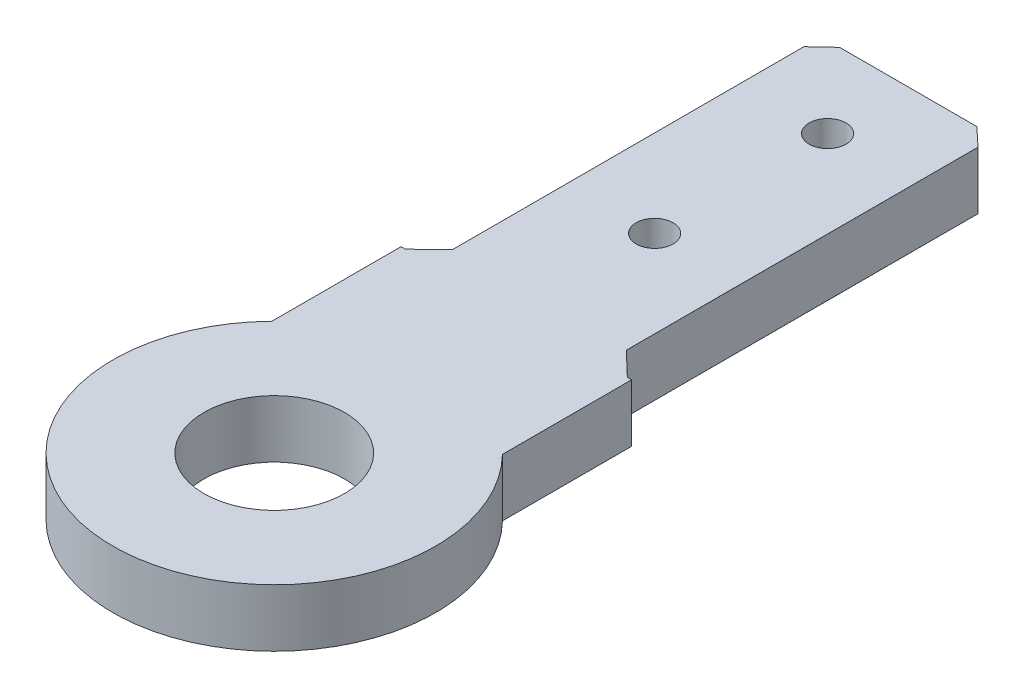
ISO-10303-21;
HEADER;
FILE_DESCRIPTION(('STEP AP214'),'2;1');
FILE_NAME('part.step','',(''),(''),'','','');
FILE_SCHEMA(('AUTOMOTIVE_DESIGN { 1 0 10303 214 1 1 1 1 }'));
ENDSEC;
DATA;
#1=APPLICATION_CONTEXT('core data for automotive mechanical design processes');
#2=APPLICATION_PROTOCOL_DEFINITION('international standard','automotive_design',2000,#1);
#3=PRODUCT_CONTEXT('',#1,'mechanical');
#4=PRODUCT('Part','Part','',(#3));
#5=PRODUCT_RELATED_PRODUCT_CATEGORY('part','',(#4));
#6=PRODUCT_DEFINITION_FORMATION('','',#4);
#7=PRODUCT_DEFINITION_CONTEXT('part definition',#1,'design');
#8=PRODUCT_DEFINITION('design','',#6,#7);
#9=PRODUCT_DEFINITION_SHAPE('','',#8);
#10=(LENGTH_UNIT() NAMED_UNIT(*) SI_UNIT(.MILLI.,.METRE.));
#11=(NAMED_UNIT(*) PLANE_ANGLE_UNIT() SI_UNIT($,.RADIAN.));
#12=(NAMED_UNIT(*) SI_UNIT($,.STERADIAN.) SOLID_ANGLE_UNIT());
#13=UNCERTAINTY_MEASURE_WITH_UNIT(LENGTH_MEASURE(1.E-05),#10,'distance_accuracy_value','');
#14=(GEOMETRIC_REPRESENTATION_CONTEXT(3) GLOBAL_UNCERTAINTY_ASSIGNED_CONTEXT((#13)) GLOBAL_UNIT_ASSIGNED_CONTEXT((#10,
#11,#12)) REPRESENTATION_CONTEXT('',''));
#15=CARTESIAN_POINT('',(0.,0.,0.));
#16=DIRECTION('',(0.,0.,1.));
#17=DIRECTION('',(1.,0.,0.));
#18=AXIS2_PLACEMENT_3D('',#15,#16,#17);
#19=CARTESIAN_POINT('',(0.,0.,20.));
#20=DIRECTION('',(0.,0.,-1.));
#21=DIRECTION('',(-1.,0.,0.));
#22=AXIS2_PLACEMENT_3D('',#19,#20,#21);
#23=CYLINDRICAL_SURFACE('',#22,7.95);
#24=DIRECTION('',(0.,0.,-1.));
#25=VECTOR('',#24,1.);
#26=CARTESIAN_POINT('',(7.54668801528194,2.5,20.));
#27=LINE('',#26,#25);
#28=CARTESIAN_POINT('',(7.55010842488886,2.50033632540635,-9.99999998193469));
#29=VERTEX_POINT('',#28);
#30=CARTESIAN_POINT('',(7.54668801528193,2.5,18.));
#31=VERTEX_POINT('',#30);
#32=EDGE_CURVE('E212',#29,#31,#27,.F.);
#33=ORIENTED_EDGE('',*,*,#32,.T.);
#34=CARTESIAN_POINT('',(7.54668798531917,2.50000009044787,18.0002));
#35=CARTESIAN_POINT('',(7.54748199861855,2.4976032419031,12.7002006014419));
#36=CARTESIAN_POINT('',(7.54827601191767,2.49520253743666,7.40020120463295));
#37=CARTESIAN_POINT('',(7.54967751223558,2.49095828591945,-1.95474391760775));
#38=CARTESIAN_POINT('',(7.55028499925449,2.48911633771188,-6.00968964376471));
#39=CARTESIAN_POINT('',(7.55089248627324,2.48727213242587,-10.0646353688978));
#40=B_SPLINE_CURVE_WITH_KNOTS('',3,(#34,#35,#36,#37,#38,#39),.UNSPECIFIED.,.F.,.F.,(4,2,4),(0.,
15.9000000000042,28.0648385700399),.UNSPECIFIED.);
#41=EDGE_CURVE('E250',#31,#29,#40,.T.);
#42=ORIENTED_EDGE('',*,*,#41,.T.);
#43=EDGE_LOOP('',(#33,#42));
#44=FACE_BOUND('',#43,.T.);
#45=ADVANCED_FACE('F63',(#44),#23,.T.);
#46=DIRECTION('',(0.,0.,-1.));
#47=VECTOR('',#46,1.);
#48=CARTESIAN_POINT('',(7.54668801528194,-2.5,20.));
#49=LINE('',#48,#47);
#50=CARTESIAN_POINT('',(7.54668801528194,-2.5,18.));
#51=VERTEX_POINT('',#50);
#52=CARTESIAN_POINT('',(7.54992772430742,-2.5000000980781,-9.99999985691599));
#53=VERTEX_POINT('',#52);
#54=EDGE_CURVE('E155',#51,#53,#49,.T.);
#55=ORIENTED_EDGE('',*,*,#54,.T.);
#56=CARTESIAN_POINT('',(7.55089248627324,-2.48727213242587,-10.0646353688978));
#57=CARTESIAN_POINT('',(7.55009847297478,-2.48968258840148,-4.76463597651099));
#58=CARTESIAN_POINT('',(7.54930445967607,-2.49208919107391,0.535363417623069));
#59=CARTESIAN_POINT('',(7.54790295935793,-2.49633024599045,9.8903085413135));
#60=CARTESIAN_POINT('',(7.54729547233863,-2.49816629599201,13.9452542701454));
#61=CARTESIAN_POINT('',(7.54668798531917,-2.50000009044787,18.0002));
#62=B_SPLINE_CURVE_WITH_KNOTS('',3,(#56,#57,#58,#59,#60,#61),.UNSPECIFIED.,.F.,.F.,(4,2,4),(0.,
15.9000000000042,28.0648385700399),.UNSPECIFIED.);
#63=EDGE_CURVE('E230',#53,#51,#62,.T.);
#64=ORIENTED_EDGE('',*,*,#63,.T.);
#65=EDGE_LOOP('',(#55,#64));
#66=FACE_BOUND('',#65,.T.);
#67=ADVANCED_FACE('F389',(#66),#23,.T.);
#68=DIRECTION('',(0.,0.,-1.));
#69=VECTOR('',#68,1.);
#70=CARTESIAN_POINT('',(-7.54668801528194,-2.5,20.));
#71=LINE('',#70,#69);
#72=CARTESIAN_POINT('',(-7.54992772430742,-2.50000009807811,-9.99999985691598));
#73=VERTEX_POINT('',#72);
#74=CARTESIAN_POINT('',(-7.54668801528194,-2.5,18.));
#75=VERTEX_POINT('',#74);
#76=EDGE_CURVE('E182',#73,#75,#71,.F.);
#77=ORIENTED_EDGE('',*,*,#76,.T.);
#78=CARTESIAN_POINT('',(-7.54668798531917,-2.50000009044787,18.0002));
#79=CARTESIAN_POINT('',(-7.54748199861855,-2.49760324190309,12.7002006014419));
#80=CARTESIAN_POINT('',(-7.54827601191767,-2.49520253743666,7.40020120463295));
#81=CARTESIAN_POINT('',(-7.54967751223558,-2.49095828591945,-1.95474391760776));
#82=CARTESIAN_POINT('',(-7.55028499925449,-2.48911633771188,-6.00968964376472));
#83=CARTESIAN_POINT('',(-7.55089248627324,-2.48727213242587,-10.0646353688979));
#84=B_SPLINE_CURVE_WITH_KNOTS('',3,(#78,#79,#80,#81,#82,#83),.UNSPECIFIED.,.F.,.F.,(4,2,4),(0.,
15.9000000000042,28.06483857004),.UNSPECIFIED.);
#85=EDGE_CURVE('E253',#75,#73,#84,.T.);
#86=ORIENTED_EDGE('',*,*,#85,.T.);
#87=EDGE_LOOP('',(#77,#86));
#88=FACE_BOUND('',#87,.T.);
#89=ADVANCED_FACE('F387',(#88),#23,.T.);
#90=DIRECTION('',(0.,0.,-1.));
#91=VECTOR('',#90,1.);
#92=CARTESIAN_POINT('',(-7.54668801528194,2.5,20.));
#93=LINE('',#92,#91);
#94=CARTESIAN_POINT('',(-7.54668801528194,2.5,18.));
#95=VERTEX_POINT('',#94);
#96=CARTESIAN_POINT('',(-7.55010842556766,2.50033632564052,-9.99999991491621));
#97=VERTEX_POINT('',#96);
#98=EDGE_CURVE('E207',#95,#97,#93,.T.);
#99=ORIENTED_EDGE('',*,*,#98,.T.);
#100=CARTESIAN_POINT('',(-7.55089248627324,2.48727213242587,-10.0646353688979));
#101=CARTESIAN_POINT('',(-7.55009847297478,2.48968258840147,-4.76463597651102));
#102=CARTESIAN_POINT('',(-7.54930445967607,2.49208919107391,0.535363417623049));
#103=CARTESIAN_POINT('',(-7.54790295935793,2.49633024599044,9.89030854131348));
#104=CARTESIAN_POINT('',(-7.54729547233863,2.49816629599201,13.9452542701454));
#105=CARTESIAN_POINT('',(-7.54668798531917,2.50000009044787,18.0002));
#106=B_SPLINE_CURVE_WITH_KNOTS('',3,(#100,#101,#102,#103,#104,#105),.UNSPECIFIED.,.F.,.F.,(4,2,
4),(0.,15.9000000000042,28.06483857004),.UNSPECIFIED.);
#107=EDGE_CURVE('E278',#97,#95,#106,.T.);
#108=ORIENTED_EDGE('',*,*,#107,.T.);
#109=EDGE_LOOP('',(#99,#108));
#110=FACE_BOUND('',#109,.T.);
#111=ADVANCED_FACE('F314',(#110),#23,.T.);
#112=CARTESIAN_POINT('',(0.,0.,-14.));
#113=DIRECTION('',(0.,0.,-1.));
#114=DIRECTION('',(-1.,0.,0.));
#115=AXIS2_PLACEMENT_3D('',#112,#113,#114);
#116=PLANE('',#115);
#117=DIRECTION('',(1.,0.,0.));
#118=VECTOR('',#117,1.);
#119=CARTESIAN_POINT('',(0.,2.5,-14.));
#120=LINE('',#119,#118);
#121=CARTESIAN_POINT('',(-5.95050203280084,2.5,-14.));
#122=VERTEX_POINT('',#121);
#123=CARTESIAN_POINT('',(5.95050203280083,2.5,-14.));
#124=VERTEX_POINT('',#123);
#125=EDGE_CURVE('E217',#122,#124,#120,.T.);
#126=ORIENTED_EDGE('',*,*,#125,.T.);
#127=DIRECTION('',(0.,-1.,0.));
#128=VECTOR('',#127,1.);
#129=CARTESIAN_POINT('',(5.95050203280083,2.56443556505418,-14.));
#130=LINE('',#129,#128);
#131=CARTESIAN_POINT('',(5.95050203280082,-2.5,-14.));
#132=VERTEX_POINT('',#131);
#133=EDGE_CURVE('E289',#124,#132,#130,.T.);
#134=ORIENTED_EDGE('',*,*,#133,.T.);
#135=DIRECTION('',(-1.,0.,0.));
#136=VECTOR('',#135,1.);
#137=CARTESIAN_POINT('',(0.,-2.5,-14.));
#138=LINE('',#137,#136);
#139=CARTESIAN_POINT('',(-5.95050203280084,-2.5,-14.));
#140=VERTEX_POINT('',#139);
#141=EDGE_CURVE('E186',#132,#140,#138,.T.);
#142=ORIENTED_EDGE('',*,*,#141,.T.);
#143=DIRECTION('',(0.,-1.,0.));
#144=VECTOR('',#143,1.);
#145=CARTESIAN_POINT('',(-5.95050203280084,2.56443556505418,-14.));
#146=LINE('',#145,#144);
#147=EDGE_CURVE('E287',#122,#140,#146,.T.);
#148=ORIENTED_EDGE('',*,*,#147,.F.);
#149=EDGE_LOOP('',(#126,#134,#142,#148));
#150=FACE_BOUND('',#149,.T.);
#151=ADVANCED_FACE('F394',(#150),#116,.T.);
#152=CARTESIAN_POINT('',(0.,-2.5,0.));
#153=DIRECTION('',(0.,-1.,0.));
#154=DIRECTION('',(0.,0.,-1.));
#155=AXIS2_PLACEMENT_3D('',#152,#153,#154);
#156=PLANE('',#155);
#157=CARTESIAN_POINT('',(0.,-2.5,8.));
#158=DIRECTION('',(0.,-1.,0.));
#159=DIRECTION('',(0.,0.,-1.));
#160=AXIS2_PLACEMENT_3D('',#157,#158,#159);
#161=CIRCLE('',#160,1.6);
#162=CARTESIAN_POINT('',(0.,-2.5,6.4));
#163=VERTEX_POINT('',#162);
#164=EDGE_CURVE('E187',#163,#163,#161,.F.);
#165=ORIENTED_EDGE('',*,*,#164,.T.);
#166=EDGE_LOOP('',(#165));
#167=FACE_BOUND('',#166,.T.);
#168=CARTESIAN_POINT('',(0.,-2.5,-7.));
#169=DIRECTION('',(0.,-1.,0.));
#170=DIRECTION('',(0.,0.,-1.));
#171=AXIS2_PLACEMENT_3D('',#168,#169,#170);
#172=CIRCLE('',#171,1.6);
#173=CARTESIAN_POINT('',(0.,-2.5,-8.6));
#174=VERTEX_POINT('',#173);
#175=EDGE_CURVE('E191',#174,#174,#172,.F.);
#176=ORIENTED_EDGE('',*,*,#175,.T.);
#177=EDGE_LOOP('',(#176));
#178=FACE_BOUND('',#177,.T.);
#179=CARTESIAN_POINT('',(0.,-2.5,41.));
#180=DIRECTION('',(0.,-1.,0.));
#181=DIRECTION('',(0.,0.,-1.));
#182=AXIS2_PLACEMENT_3D('',#179,#180,#181);
#183=CIRCLE('',#182,6.1);
#184=CARTESIAN_POINT('',(0.,-2.5,34.9));
#185=VERTEX_POINT('',#184);
#186=EDGE_CURVE('E164',#185,#185,#183,.F.);
#187=ORIENTED_EDGE('',*,*,#186,.T.);
#188=EDGE_LOOP('',(#187));
#189=FACE_BOUND('',#188,.T.);
#190=DIRECTION('',(1.,0.,0.));
#191=VECTOR('',#190,1.);
#192=CARTESIAN_POINT('',(0.,-2.5,20.));
#193=LINE('',#192,#191);
#194=CARTESIAN_POINT('',(-10.,-2.5,20.));
#195=VERTEX_POINT('',#194);
#196=CARTESIAN_POINT('',(-9.63080993478742,-2.5,20.));
#197=VERTEX_POINT('',#196);
#198=EDGE_CURVE('E163',#195,#197,#193,.T.);
#199=ORIENTED_EDGE('',*,*,#198,.T.);
#200=DIRECTION('',(0.721518242255954,0.,-0.692395426105545));
#201=VECTOR('',#200,1.);
#202=CARTESIAN_POINT('',(-9.63080993478742,-2.5,20.));
#203=LINE('',#202,#201);
#204=EDGE_CURVE('E173',#197,#75,#203,.T.);
#205=ORIENTED_EDGE('',*,*,#204,.T.);
#206=ORIENTED_EDGE('',*,*,#76,.F.);
#207=DIRECTION('',(-0.000149813845391488,0.,-0.999999988777906));
#208=VECTOR('',#207,1.);
#209=CARTESIAN_POINT('',(-7.5508828029571,-2.5,-9.99999971383199));
#210=LINE('',#209,#208);
#211=CARTESIAN_POINT('',(-7.55125733761765,-2.5,-12.5));
#212=VERTEX_POINT('',#211);
#213=EDGE_CURVE('E356',#73,#212,#210,.T.);
#214=ORIENTED_EDGE('',*,*,#213,.T.);
#215=DIRECTION('',(0.729698240334367,0.,-0.683769316402051));
#216=VECTOR('',#215,1.);
#217=CARTESIAN_POINT('',(-7.55125733761765,-2.5,-12.5));
#218=LINE('',#217,#216);
#219=EDGE_CURVE('E190',#212,#140,#218,.T.);
#220=ORIENTED_EDGE('',*,*,#219,.T.);
#221=ORIENTED_EDGE('',*,*,#141,.F.);
#222=DIRECTION('',(0.729698240334369,0.,0.68376931640205));
#223=VECTOR('',#222,1.);
#224=CARTESIAN_POINT('',(5.95050203280082,-2.5,-14.));
#225=LINE('',#224,#223);
#226=CARTESIAN_POINT('',(7.55125733761765,-2.5,-12.5));
#227=VERTEX_POINT('',#226);
#228=EDGE_CURVE('E185',#132,#227,#225,.T.);
#229=ORIENTED_EDGE('',*,*,#228,.T.);
#230=DIRECTION('',(-0.000149813845391335,0.,0.999999988777906));
#231=VECTOR('',#230,1.);
#232=CARTESIAN_POINT('',(7.55125733763482,-2.5,-12.5000001146424));
#233=LINE('',#232,#231);
#234=EDGE_CURVE('E177',#227,#53,#233,.T.);
#235=ORIENTED_EDGE('',*,*,#234,.T.);
#236=ORIENTED_EDGE('',*,*,#54,.F.);
#237=DIRECTION('',(0.721518242255954,0.,0.692395426105545));
#238=VECTOR('',#237,1.);
#239=CARTESIAN_POINT('',(7.54668801528194,-2.5,18.));
#240=LINE('',#239,#238);
#241=CARTESIAN_POINT('',(9.63080993478742,-2.5,20.));
#242=VERTEX_POINT('',#241);
#243=EDGE_CURVE('E67',#51,#242,#240,.T.);
#244=ORIENTED_EDGE('',*,*,#243,.T.);
#245=CARTESIAN_POINT('',(10.,-2.5,20.));
#246=VERTEX_POINT('',#245);
#247=EDGE_CURVE('E82',#242,#246,#193,.T.);
#248=ORIENTED_EDGE('',*,*,#247,.T.);
#249=DIRECTION('',(0.,0.,1.));
#250=VECTOR('',#249,1.);
#251=CARTESIAN_POINT('',(10.,-2.5,41.));
#252=LINE('',#251,#250);
#253=CARTESIAN_POINT('',(10.,-2.5,31.2020410288673));
#254=VERTEX_POINT('',#253);
#255=EDGE_CURVE('E161',#246,#254,#252,.T.);
#256=ORIENTED_EDGE('',*,*,#255,.T.);
#257=CARTESIAN_POINT('',(0.,-2.5,41.));
#258=DIRECTION('',(0.,-1.,0.));
#259=DIRECTION('',(0.,0.,-1.));
#260=AXIS2_PLACEMENT_3D('',#257,#258,#259);
#261=CIRCLE('',#260,14.);
#262=CARTESIAN_POINT('',(-10.,-2.5,31.2020410288673));
#263=VERTEX_POINT('',#262);
#264=EDGE_CURVE('E156',#263,#254,#261,.F.);
#265=ORIENTED_EDGE('',*,*,#264,.F.);
#266=DIRECTION('',(0.,0.,-1.));
#267=VECTOR('',#266,1.);
#268=CARTESIAN_POINT('',(-10.,-2.5,26.));
#269=LINE('',#268,#267);
#270=EDGE_CURVE('E157',#263,#195,#269,.T.);
#271=ORIENTED_EDGE('',*,*,#270,.T.);
#272=EDGE_LOOP('',(#199,#205,#206,#214,#220,#221,#229,#235,#236,#244,#248,#256,#265,#271));
#273=FACE_BOUND('',#272,.T.);
#274=ADVANCED_FACE('F152',(#167,#178,#189,#273),#156,.T.);
#275=CARTESIAN_POINT('',(0.,2.5,0.));
#276=DIRECTION('',(0.,1.,0.));
#277=DIRECTION('',(0.,0.,1.));
#278=AXIS2_PLACEMENT_3D('',#275,#276,#277);
#279=PLANE('',#278);
#280=CARTESIAN_POINT('',(0.,2.5,8.));
#281=DIRECTION('',(0.,1.,0.));
#282=DIRECTION('',(0.,0.,1.));
#283=AXIS2_PLACEMENT_3D('',#280,#281,#282);
#284=CIRCLE('',#283,1.6);
#285=CARTESIAN_POINT('',(0.,2.5,9.6));
#286=VERTEX_POINT('',#285);
#287=EDGE_CURVE('E218',#286,#286,#284,.F.);
#288=ORIENTED_EDGE('',*,*,#287,.T.);
#289=EDGE_LOOP('',(#288));
#290=FACE_BOUND('',#289,.T.);
#291=CARTESIAN_POINT('',(0.,2.5,-7.));
#292=DIRECTION('',(0.,1.,0.));
#293=DIRECTION('',(0.,0.,1.));
#294=AXIS2_PLACEMENT_3D('',#291,#292,#293);
#295=CIRCLE('',#294,1.6);
#296=CARTESIAN_POINT('',(0.,2.5,-5.4));
#297=VERTEX_POINT('',#296);
#298=EDGE_CURVE('E221',#297,#297,#295,.F.);
#299=ORIENTED_EDGE('',*,*,#298,.T.);
#300=EDGE_LOOP('',(#299));
#301=FACE_BOUND('',#300,.T.);
#302=CARTESIAN_POINT('',(0.,2.5,41.));
#303=DIRECTION('',(0.,1.,0.));
#304=DIRECTION('',(0.,0.,1.));
#305=AXIS2_PLACEMENT_3D('',#302,#303,#304);
#306=CIRCLE('',#305,6.1);
#307=CARTESIAN_POINT('',(0.,2.5,47.1));
#308=VERTEX_POINT('',#307);
#309=EDGE_CURVE('E192',#308,#308,#306,.F.);
#310=ORIENTED_EDGE('',*,*,#309,.T.);
#311=EDGE_LOOP('',(#310));
#312=FACE_BOUND('',#311,.T.);
#313=ORIENTED_EDGE('',*,*,#98,.F.);
#314=DIRECTION('',(-0.721518242255954,0.,0.692395426105545));
#315=VECTOR('',#314,1.);
#316=CARTESIAN_POINT('',(-7.54668801528194,2.5,18.));
#317=LINE('',#316,#315);
#318=CARTESIAN_POINT('',(-9.63080993478742,2.5,20.));
#319=VERTEX_POINT('',#318);
#320=EDGE_CURVE('E14',#95,#319,#317,.T.);
#321=ORIENTED_EDGE('',*,*,#320,.T.);
#322=DIRECTION('',(-1.,0.,0.));
#323=VECTOR('',#322,1.);
#324=CARTESIAN_POINT('',(0.,2.5,20.));
#325=LINE('',#324,#323);
#326=CARTESIAN_POINT('',(-10.,2.5,20.));
#327=VERTEX_POINT('',#326);
#328=EDGE_CURVE('E198',#319,#327,#325,.T.);
#329=ORIENTED_EDGE('',*,*,#328,.T.);
#330=DIRECTION('',(0.,0.,1.));
#331=VECTOR('',#330,1.);
#332=CARTESIAN_POINT('',(-10.,2.5,26.));
#333=LINE('',#332,#331);
#334=CARTESIAN_POINT('',(-10.,2.5,31.2020410288673));
#335=VERTEX_POINT('',#334);
#336=EDGE_CURVE('E195',#327,#335,#333,.T.);
#337=ORIENTED_EDGE('',*,*,#336,.T.);
#338=CARTESIAN_POINT('',(0.,2.5,41.));
#339=DIRECTION('',(0.,1.,0.));
#340=DIRECTION('',(0.,0.,1.));
#341=AXIS2_PLACEMENT_3D('',#338,#339,#340);
#342=CIRCLE('',#341,14.);
#343=CARTESIAN_POINT('',(10.,2.5,31.2020410288673));
#344=VERTEX_POINT('',#343);
#345=EDGE_CURVE('E199',#344,#335,#342,.F.);
#346=ORIENTED_EDGE('',*,*,#345,.F.);
#347=DIRECTION('',(0.,0.,-1.));
#348=VECTOR('',#347,1.);
#349=CARTESIAN_POINT('',(10.,2.5,41.));
#350=LINE('',#349,#348);
#351=CARTESIAN_POINT('',(10.,2.5,20.));
#352=VERTEX_POINT('',#351);
#353=EDGE_CURVE('E202',#344,#352,#350,.T.);
#354=ORIENTED_EDGE('',*,*,#353,.T.);
#355=CARTESIAN_POINT('',(9.63080993478742,2.5,20.));
#356=VERTEX_POINT('',#355);
#357=EDGE_CURVE('E205',#352,#356,#325,.T.);
#358=ORIENTED_EDGE('',*,*,#357,.T.);
#359=DIRECTION('',(-0.721518242255954,0.,-0.692395426105545));
#360=VECTOR('',#359,1.);
#361=CARTESIAN_POINT('',(9.63080993478742,2.5,20.));
#362=LINE('',#361,#360);
#363=EDGE_CURVE('E73',#356,#31,#362,.T.);
#364=ORIENTED_EDGE('',*,*,#363,.T.);
#365=ORIENTED_EDGE('',*,*,#32,.F.);
#366=DIRECTION('',(0.000149813845391488,0.,-0.999999988777906));
#367=VECTOR('',#366,1.);
#368=CARTESIAN_POINT('',(7.5508828029571,2.5,-9.99999971383199));
#369=LINE('',#368,#367);
#370=CARTESIAN_POINT('',(7.55125733761765,2.5,-12.5));
#371=VERTEX_POINT('',#370);
#372=EDGE_CURVE('E364',#29,#371,#369,.T.);
#373=ORIENTED_EDGE('',*,*,#372,.T.);
#374=DIRECTION('',(-0.729698240334368,0.,-0.68376931640205));
#375=VECTOR('',#374,1.);
#376=CARTESIAN_POINT('',(5.95050203280083,2.5,-14.));
#377=LINE('',#376,#375);
#378=EDGE_CURVE('E362',#124,#371,#377,.F.);
#379=ORIENTED_EDGE('',*,*,#378,.F.);
#380=ORIENTED_EDGE('',*,*,#125,.F.);
#381=DIRECTION('',(-0.729698240334367,0.,0.683769316402051));
#382=VECTOR('',#381,1.);
#383=CARTESIAN_POINT('',(-7.55125733761765,2.5,-12.5));
#384=LINE('',#383,#382);
#385=CARTESIAN_POINT('',(-7.55125733761765,2.5,-12.5));
#386=VERTEX_POINT('',#385);
#387=EDGE_CURVE('E358',#386,#122,#384,.F.);
#388=ORIENTED_EDGE('',*,*,#387,.F.);
#389=DIRECTION('',(0.000149813845391335,0.,0.999999988777906));
#390=VECTOR('',#389,1.);
#391=CARTESIAN_POINT('',(-7.55125733763482,2.5,-12.5000001146424));
#392=LINE('',#391,#390);
#393=EDGE_CURVE('E312',#386,#97,#392,.T.);
#394=ORIENTED_EDGE('',*,*,#393,.T.);
#395=EDGE_LOOP('',(#313,#321,#329,#337,#346,#354,#358,#364,#365,#373,#379,#380,#388,#394));
#396=FACE_BOUND('',#395,.T.);
#397=ADVANCED_FACE('F307',(#290,#301,#312,#396),#279,.T.);
#398=CARTESIAN_POINT('',(10.,6.,41.));
#399=DIRECTION('',(-1.,0.,0.));
#400=DIRECTION('',(0.,1.,0.));
#401=AXIS2_PLACEMENT_3D('',#398,#399,#400);
#402=PLANE('',#401);
#403=ORIENTED_EDGE('',*,*,#353,.F.);
#404=DIRECTION('',(0.,-1.,0.));
#405=VECTOR('',#404,1.);
#406=CARTESIAN_POINT('',(10.,6.,31.2020410288673));
#407=LINE('',#406,#405);
#408=EDGE_CURVE('E340',#344,#254,#407,.T.);
#409=ORIENTED_EDGE('',*,*,#408,.T.);
#410=ORIENTED_EDGE('',*,*,#255,.F.);
#411=DIRECTION('',(0.,1.,0.));
#412=VECTOR('',#411,1.);
#413=CARTESIAN_POINT('',(10.,0.,20.));
#414=LINE('',#413,#412);
#415=EDGE_CURVE('E160',#246,#352,#414,.T.);
#416=ORIENTED_EDGE('',*,*,#415,.T.);
#417=EDGE_LOOP('',(#403,#409,#410,#416));
#418=FACE_BOUND('',#417,.T.);
#419=ADVANCED_FACE('F492',(#418),#402,.F.);
#420=CARTESIAN_POINT('',(-10.,6.,26.));
#421=DIRECTION('',(1.,0.,0.));
#422=DIRECTION('',(0.,0.,1.));
#423=AXIS2_PLACEMENT_3D('',#420,#421,#422);
#424=PLANE('',#423);
#425=ORIENTED_EDGE('',*,*,#336,.F.);
#426=DIRECTION('',(0.,-1.,0.));
#427=VECTOR('',#426,1.);
#428=CARTESIAN_POINT('',(-10.,0.,20.));
#429=LINE('',#428,#427);
#430=EDGE_CURVE('E338',#327,#195,#429,.T.);
#431=ORIENTED_EDGE('',*,*,#430,.T.);
#432=ORIENTED_EDGE('',*,*,#270,.F.);
#433=DIRECTION('',(0.,-1.,0.));
#434=VECTOR('',#433,1.);
#435=CARTESIAN_POINT('',(-10.,6.,31.2020410288673));
#436=LINE('',#435,#434);
#437=EDGE_CURVE('E337',#263,#335,#436,.F.);
#438=ORIENTED_EDGE('',*,*,#437,.T.);
#439=EDGE_LOOP('',(#425,#431,#432,#438));
#440=FACE_BOUND('',#439,.T.);
#441=ADVANCED_FACE('F336',(#440),#424,.F.);
#442=CARTESIAN_POINT('',(0.,0.,20.));
#443=DIRECTION('',(0.,0.,1.));
#444=DIRECTION('',(1.,0.,0.));
#445=AXIS2_PLACEMENT_3D('',#442,#443,#444);
#446=PLANE('',#445);
#447=ORIENTED_EDGE('',*,*,#357,.F.);
#448=ORIENTED_EDGE('',*,*,#415,.F.);
#449=ORIENTED_EDGE('',*,*,#247,.F.);
#450=DIRECTION('',(0.,-1.,0.));
#451=VECTOR('',#450,1.);
#452=CARTESIAN_POINT('',(9.63080993478742,2.56443556505418,20.));
#453=LINE('',#452,#451);
#454=EDGE_CURVE('E141',#356,#242,#453,.T.);
#455=ORIENTED_EDGE('',*,*,#454,.F.);
#456=EDGE_LOOP('',(#447,#448,#449,#455));
#457=FACE_BOUND('',#456,.T.);
#458=ADVANCED_FACE('F65',(#457),#446,.F.);
#459=ORIENTED_EDGE('',*,*,#328,.F.);
#460=DIRECTION('',(0.,-1.,0.));
#461=VECTOR('',#460,1.);
#462=CARTESIAN_POINT('',(-9.63080993478742,2.56443556505418,20.));
#463=LINE('',#462,#461);
#464=EDGE_CURVE('E147',#319,#197,#463,.T.);
#465=ORIENTED_EDGE('',*,*,#464,.T.);
#466=ORIENTED_EDGE('',*,*,#198,.F.);
#467=ORIENTED_EDGE('',*,*,#430,.F.);
#468=EDGE_LOOP('',(#459,#465,#466,#467));
#469=FACE_BOUND('',#468,.T.);
#470=ADVANCED_FACE('F299',(#469),#446,.F.);
#471=CARTESIAN_POINT('',(0.,6.,41.));
#472=DIRECTION('',(0.,-1.,0.));
#473=DIRECTION('',(0.,0.,-1.));
#474=AXIS2_PLACEMENT_3D('',#471,#472,#473);
#475=CYLINDRICAL_SURFACE('',#474,14.);
#476=ORIENTED_EDGE('',*,*,#408,.F.);
#477=ORIENTED_EDGE('',*,*,#345,.T.);
#478=ORIENTED_EDGE('',*,*,#437,.F.);
#479=ORIENTED_EDGE('',*,*,#264,.T.);
#480=EDGE_LOOP('',(#476,#477,#478,#479));
#481=FACE_BOUND('',#480,.T.);
#482=ADVANCED_FACE('F339',(#481),#475,.T.);
#483=CARTESIAN_POINT('',(0.,-10.000025,41.));
#484=DIRECTION('',(0.,1.,0.));
#485=DIRECTION('',(0.,0.,1.));
#486=AXIS2_PLACEMENT_3D('',#483,#484,#485);
#487=CYLINDRICAL_SURFACE('',#486,6.1);
#488=ORIENTED_EDGE('',*,*,#186,.F.);
#489=EDGE_LOOP('',(#488));
#490=FACE_BOUND('',#489,.T.);
#491=ORIENTED_EDGE('',*,*,#309,.F.);
#492=EDGE_LOOP('',(#491));
#493=FACE_BOUND('',#492,.T.);
#494=ADVANCED_FACE('F515',(#490,#493),#487,.F.);
#495=CARTESIAN_POINT('',(0.,-10.000025,8.));
#496=DIRECTION('',(0.,1.,0.));
#497=DIRECTION('',(0.,0.,1.));
#498=AXIS2_PLACEMENT_3D('',#495,#496,#497);
#499=CYLINDRICAL_SURFACE('',#498,1.6);
#500=ORIENTED_EDGE('',*,*,#164,.F.);
#501=EDGE_LOOP('',(#500));
#502=FACE_BOUND('',#501,.T.);
#503=ORIENTED_EDGE('',*,*,#287,.F.);
#504=EDGE_LOOP('',(#503));
#505=FACE_BOUND('',#504,.T.);
#506=ADVANCED_FACE('F522',(#502,#505),#499,.F.);
#507=CARTESIAN_POINT('',(0.,-10.000025,-7.));
#508=DIRECTION('',(0.,1.,0.));
#509=DIRECTION('',(0.,0.,1.));
#510=AXIS2_PLACEMENT_3D('',#507,#508,#509);
#511=CYLINDRICAL_SURFACE('',#510,1.6);
#512=ORIENTED_EDGE('',*,*,#175,.F.);
#513=EDGE_LOOP('',(#512));
#514=FACE_BOUND('',#513,.T.);
#515=ORIENTED_EDGE('',*,*,#298,.F.);
#516=EDGE_LOOP('',(#515));
#517=FACE_BOUND('',#516,.T.);
#518=ADVANCED_FACE('F267',(#514,#517),#511,.F.);
#519=CARTESIAN_POINT('',(-7.54668801528194,2.56443556505418,18.));
#520=DIRECTION('',(-0.999999988777906,0.,0.000149813845391363));
#521=DIRECTION('',(0.000149813845391363,0.,0.999999988777906));
#522=AXIS2_PLACEMENT_3D('',#519,#520,#521);
#523=PLANE('',#522);
#524=DIRECTION('',(0.,-1.,0.));
#525=VECTOR('',#524,1.);
#526=CARTESIAN_POINT('',(-7.54668801528194,2.56443556505418,18.));
#527=LINE('',#526,#525);
#528=EDGE_CURVE('E281',#95,#75,#527,.T.);
#529=ORIENTED_EDGE('',*,*,#528,.F.);
#530=ORIENTED_EDGE('',*,*,#107,.F.);
#531=ORIENTED_EDGE('',*,*,#393,.F.);
#532=DIRECTION('',(0.,-1.,0.));
#533=VECTOR('',#532,1.);
#534=CARTESIAN_POINT('',(-7.55125733761765,2.56443556505418,-12.5));
#535=LINE('',#534,#533);
#536=EDGE_CURVE('E284',#386,#212,#535,.T.);
#537=ORIENTED_EDGE('',*,*,#536,.T.);
#538=ORIENTED_EDGE('',*,*,#213,.F.);
#539=ORIENTED_EDGE('',*,*,#85,.F.);
#540=EDGE_LOOP('',(#529,#530,#531,#537,#538,#539));
#541=FACE_BOUND('',#540,.T.);
#542=ADVANCED_FACE('F262',(#541),#523,.T.);
#543=CARTESIAN_POINT('',(-7.55125733761765,2.56443556505418,-12.5));
#544=DIRECTION('',(-0.683769316402051,0.,-0.729698240334367));
#545=DIRECTION('',(-0.729698240334367,0.,0.683769316402051));
#546=AXIS2_PLACEMENT_3D('',#543,#544,#545);
#547=PLANE('',#546);
#548=ORIENTED_EDGE('',*,*,#147,.T.);
#549=ORIENTED_EDGE('',*,*,#219,.F.);
#550=ORIENTED_EDGE('',*,*,#536,.F.);
#551=ORIENTED_EDGE('',*,*,#387,.T.);
#552=EDGE_LOOP('',(#548,#549,#550,#551));
#553=FACE_BOUND('',#552,.T.);
#554=ADVANCED_FACE('F266',(#553),#547,.T.);
#555=CARTESIAN_POINT('',(-7.54668801528194,2.56443556505418,18.));
#556=DIRECTION('',(-0.692395426105545,0.,-0.721518242255953));
#557=DIRECTION('',(-0.721518242255953,0.,0.692395426105545));
#558=AXIS2_PLACEMENT_3D('',#555,#556,#557);
#559=PLANE('',#558);
#560=ORIENTED_EDGE('',*,*,#528,.T.);
#561=ORIENTED_EDGE('',*,*,#204,.F.);
#562=ORIENTED_EDGE('',*,*,#464,.F.);
#563=ORIENTED_EDGE('',*,*,#320,.F.);
#564=EDGE_LOOP('',(#560,#561,#562,#563));
#565=FACE_BOUND('',#564,.T.);
#566=ADVANCED_FACE('F269',(#565),#559,.T.);
#567=CARTESIAN_POINT('',(7.54668801528194,2.56443556505418,18.));
#568=DIRECTION('',(0.692395426105545,0.,-0.721518242255953));
#569=DIRECTION('',(-0.721518242255953,0.,-0.692395426105545));
#570=AXIS2_PLACEMENT_3D('',#567,#568,#569);
#571=PLANE('',#570);
#572=ORIENTED_EDGE('',*,*,#454,.T.);
#573=ORIENTED_EDGE('',*,*,#243,.F.);
#574=DIRECTION('',(0.,-1.,0.));
#575=VECTOR('',#574,1.);
#576=CARTESIAN_POINT('',(7.54668801528194,2.56443556505418,18.));
#577=LINE('',#576,#575);
#578=EDGE_CURVE('E148',#31,#51,#577,.T.);
#579=ORIENTED_EDGE('',*,*,#578,.F.);
#580=ORIENTED_EDGE('',*,*,#363,.F.);
#581=EDGE_LOOP('',(#572,#573,#579,#580));
#582=FACE_BOUND('',#581,.T.);
#583=ADVANCED_FACE('F142',(#582),#571,.T.);
#584=CARTESIAN_POINT('',(7.55125733761765,2.56443556505418,-12.5));
#585=DIRECTION('',(0.999999988777906,0.,0.000149813845391363));
#586=DIRECTION('',(0.000149813845391363,0.,-0.999999988777906));
#587=AXIS2_PLACEMENT_3D('',#584,#585,#586);
#588=PLANE('',#587);
#589=ORIENTED_EDGE('',*,*,#234,.F.);
#590=DIRECTION('',(0.,-1.,0.));
#591=VECTOR('',#590,1.);
#592=CARTESIAN_POINT('',(7.55125733761765,2.56443556505418,-12.5));
#593=LINE('',#592,#591);
#594=EDGE_CURVE('E292',#371,#227,#593,.T.);
#595=ORIENTED_EDGE('',*,*,#594,.F.);
#596=ORIENTED_EDGE('',*,*,#372,.F.);
#597=ORIENTED_EDGE('',*,*,#41,.F.);
#598=ORIENTED_EDGE('',*,*,#578,.T.);
#599=ORIENTED_EDGE('',*,*,#63,.F.);
#600=EDGE_LOOP('',(#589,#595,#596,#597,#598,#599));
#601=FACE_BOUND('',#600,.T.);
#602=ADVANCED_FACE('F235',(#601),#588,.T.);
#603=CARTESIAN_POINT('',(5.95050203280083,2.56443556505418,-14.));
#604=DIRECTION('',(0.68376931640205,0.,-0.729698240334368));
#605=DIRECTION('',(-0.729698240334368,0.,-0.68376931640205));
#606=AXIS2_PLACEMENT_3D('',#603,#604,#605);
#607=PLANE('',#606);
#608=ORIENTED_EDGE('',*,*,#594,.T.);
#609=ORIENTED_EDGE('',*,*,#228,.F.);
#610=ORIENTED_EDGE('',*,*,#133,.F.);
#611=ORIENTED_EDGE('',*,*,#378,.T.);
#612=EDGE_LOOP('',(#608,#609,#610,#611));
#613=FACE_BOUND('',#612,.T.);
#614=ADVANCED_FACE('F240',(#613),#607,.T.);
#615=CLOSED_SHELL('',(#45,#67,#89,#111,#151,#274,#397,#419,#441,#458,#470,#482,#494,#506,#518,
#542,#554,#566,#583,#602,#614));
#616=MANIFOLD_SOLID_BREP('B2',#615);
#617=ADVANCED_BREP_SHAPE_REPRESENTATION('',(#18,#616),#14);
#618=SHAPE_DEFINITION_REPRESENTATION(#9,#617);
ENDSEC;
END-ISO-10303-21;
